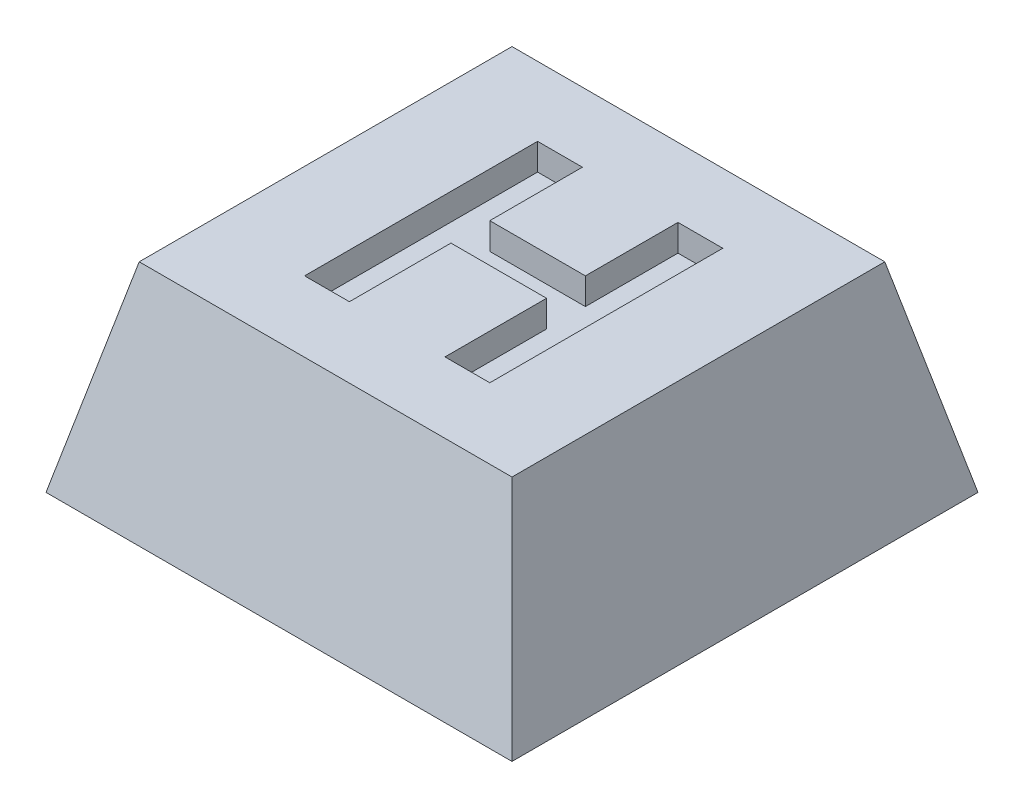
ISO-10303-21;
HEADER;
FILE_DESCRIPTION(('STEP AP214'),'2;1');
FILE_NAME('part.step','',(''),(''),'','','');
FILE_SCHEMA(('AUTOMOTIVE_DESIGN { 1 0 10303 214 1 1 1 1 }'));
ENDSEC;
DATA;
#1=APPLICATION_CONTEXT('core data for automotive mechanical design processes');
#2=APPLICATION_PROTOCOL_DEFINITION('international standard','automotive_design',2000,#1);
#3=PRODUCT_CONTEXT('',#1,'mechanical');
#4=PRODUCT('Part','Part','',(#3));
#5=PRODUCT_RELATED_PRODUCT_CATEGORY('part','',(#4));
#6=PRODUCT_DEFINITION_FORMATION('','',#4);
#7=PRODUCT_DEFINITION_CONTEXT('part definition',#1,'design');
#8=PRODUCT_DEFINITION('design','',#6,#7);
#9=PRODUCT_DEFINITION_SHAPE('','',#8);
#10=(LENGTH_UNIT() NAMED_UNIT(*) SI_UNIT(.MILLI.,.METRE.));
#11=(NAMED_UNIT(*) PLANE_ANGLE_UNIT() SI_UNIT($,.RADIAN.));
#12=(NAMED_UNIT(*) SI_UNIT($,.STERADIAN.) SOLID_ANGLE_UNIT());
#13=UNCERTAINTY_MEASURE_WITH_UNIT(LENGTH_MEASURE(1.E-05),#10,'distance_accuracy_value','');
#14=(GEOMETRIC_REPRESENTATION_CONTEXT(3) GLOBAL_UNCERTAINTY_ASSIGNED_CONTEXT((#13)) GLOBAL_UNIT_ASSIGNED_CONTEXT((#10,
#11,#12)) REPRESENTATION_CONTEXT('',''));
#15=CARTESIAN_POINT('',(0.,0.,0.));
#16=DIRECTION('',(0.,0.,1.));
#17=DIRECTION('',(1.,0.,0.));
#18=AXIS2_PLACEMENT_3D('',#15,#16,#17);
#19=CARTESIAN_POINT('',(0.,3.,0.));
#20=DIRECTION('',(0.,-1.,0.));
#21=DIRECTION('',(0.,0.,-1.));
#22=AXIS2_PLACEMENT_3D('',#19,#20,#21);
#23=PLANE('',#22);
#24=DIRECTION('',(-1.,0.,0.));
#25=VECTOR('',#24,1.);
#26=CARTESIAN_POINT('',(11.,3.,-0.7));
#27=LINE('',#26,#25);
#28=CARTESIAN_POINT('',(6.3,3.,-0.7));
#29=VERTEX_POINT('',#28);
#30=CARTESIAN_POINT('',(0.7,3.,-0.7));
#31=VERTEX_POINT('',#30);
#32=EDGE_CURVE('E65',#29,#31,#27,.T.);
#33=ORIENTED_EDGE('',*,*,#32,.F.);
#34=DIRECTION('',(0.,0.,1.));
#35=VECTOR('',#34,1.);
#36=CARTESIAN_POINT('',(6.3,3.,-7.));
#37=LINE('',#36,#35);
#38=CARTESIAN_POINT('',(6.3,3.,-6.3));
#39=VERTEX_POINT('',#38);
#40=EDGE_CURVE('E206',#39,#29,#37,.T.);
#41=ORIENTED_EDGE('',*,*,#40,.F.);
#42=DIRECTION('',(-1.,0.,0.));
#43=VECTOR('',#42,1.);
#44=CARTESIAN_POINT('',(11.,3.,-6.3));
#45=LINE('',#44,#43);
#46=CARTESIAN_POINT('',(0.699999999999998,3.,-6.3));
#47=VERTEX_POINT('',#46);
#48=EDGE_CURVE('E193',#39,#47,#45,.T.);
#49=ORIENTED_EDGE('',*,*,#48,.T.);
#50=DIRECTION('',(0.,0.,1.));
#51=VECTOR('',#50,1.);
#52=CARTESIAN_POINT('',(0.7,3.,-7.));
#53=LINE('',#52,#51);
#54=EDGE_CURVE('E207',#47,#31,#53,.T.);
#55=ORIENTED_EDGE('',*,*,#54,.T.);
#56=EDGE_LOOP('',(#33,#41,#49,#55));
#57=FACE_BOUND('',#56,.T.);
#58=DIRECTION('',(-1.,0.,0.));
#59=VECTOR('',#58,1.);
#60=CARTESIAN_POINT('',(2.79808060124008,3.,-1.75928235155919));
#61=LINE('',#60,#59);
#62=CARTESIAN_POINT('',(2.79808060124008,3.,-1.75928235155919));
#63=VERTEX_POINT('',#62);
#64=CARTESIAN_POINT('',(2.12500367816316,3.,-1.75928235155919));
#65=VERTEX_POINT('',#64);
#66=EDGE_CURVE('E58',#63,#65,#61,.T.);
#67=ORIENTED_EDGE('',*,*,#66,.T.);
#68=DIRECTION('',(0.,0.,-1.));
#69=VECTOR('',#68,1.);
#70=CARTESIAN_POINT('',(2.12500367816316,3.,-1.75928235155919));
#71=LINE('',#70,#69);
#72=CARTESIAN_POINT('',(2.12500367816316,3.,-5.25928235155919));
#73=VERTEX_POINT('',#72);
#74=EDGE_CURVE('E177',#65,#73,#71,.T.);
#75=ORIENTED_EDGE('',*,*,#74,.T.);
#76=DIRECTION('',(1.,0.,0.));
#77=VECTOR('',#76,1.);
#78=CARTESIAN_POINT('',(2.12500367816316,3.,-5.25928235155919));
#79=LINE('',#78,#77);
#80=CARTESIAN_POINT('',(2.79808060124008,3.,-5.25928235155919));
#81=VERTEX_POINT('',#80);
#82=EDGE_CURVE('E532',#73,#81,#79,.T.);
#83=ORIENTED_EDGE('',*,*,#82,.T.);
#84=DIRECTION('',(0.,0.,1.));
#85=VECTOR('',#84,1.);
#86=CARTESIAN_POINT('',(2.79808060124008,3.,-5.25928235155919));
#87=LINE('',#86,#85);
#88=CARTESIAN_POINT('',(2.79808060124008,3.,-3.86825671053355));
#89=VERTEX_POINT('',#88);
#90=EDGE_CURVE('E534',#81,#89,#87,.T.);
#91=ORIENTED_EDGE('',*,*,#90,.T.);
#92=DIRECTION('',(1.,0.,0.));
#93=VECTOR('',#92,1.);
#94=CARTESIAN_POINT('',(2.79808060124008,3.,-3.86825671053355));
#95=LINE('',#94,#93);
#96=CARTESIAN_POINT('',(4.23397803713752,3.,-3.86825671053355));
#97=VERTEX_POINT('',#96);
#98=EDGE_CURVE('E539',#89,#97,#95,.T.);
#99=ORIENTED_EDGE('',*,*,#98,.T.);
#100=DIRECTION('',(0.,0.,-1.));
#101=VECTOR('',#100,1.);
#102=CARTESIAN_POINT('',(4.23397803713752,3.,-3.86825671053355));
#103=LINE('',#102,#101);
#104=CARTESIAN_POINT('',(4.23397803713752,3.,-5.25928235155919));
#105=VERTEX_POINT('',#104);
#106=EDGE_CURVE('E549',#97,#105,#103,.T.);
#107=ORIENTED_EDGE('',*,*,#106,.T.);
#108=DIRECTION('',(1.,0.,0.));
#109=VECTOR('',#108,1.);
#110=CARTESIAN_POINT('',(4.23397803713752,3.,-5.25928235155919));
#111=LINE('',#110,#109);
#112=CARTESIAN_POINT('',(4.90705496021444,3.,-5.25928235155919));
#113=VERTEX_POINT('',#112);
#114=EDGE_CURVE('E553',#105,#113,#111,.T.);
#115=ORIENTED_EDGE('',*,*,#114,.T.);
#116=DIRECTION('',(0.,0.,1.));
#117=VECTOR('',#116,1.);
#118=CARTESIAN_POINT('',(4.90705496021444,3.,-5.25928235155919));
#119=LINE('',#118,#117);
#120=CARTESIAN_POINT('',(4.90705496021444,3.,-1.75928235155919));
#121=VERTEX_POINT('',#120);
#122=EDGE_CURVE('E557',#113,#121,#119,.T.);
#123=ORIENTED_EDGE('',*,*,#122,.T.);
#124=DIRECTION('',(-1.,0.,0.));
#125=VECTOR('',#124,1.);
#126=CARTESIAN_POINT('',(4.90705496021444,3.,-1.75928235155919));
#127=LINE('',#126,#125);
#128=CARTESIAN_POINT('',(4.23397803713752,3.,-1.75928235155919));
#129=VERTEX_POINT('',#128);
#130=EDGE_CURVE('E498',#121,#129,#127,.T.);
#131=ORIENTED_EDGE('',*,*,#130,.T.);
#132=DIRECTION('',(0.,0.,-1.));
#133=VECTOR('',#132,1.);
#134=CARTESIAN_POINT('',(4.23397803713752,3.,-1.75928235155919));
#135=LINE('',#134,#133);
#136=CARTESIAN_POINT('',(4.23397803713752,3.,-3.28492337720022));
#137=VERTEX_POINT('',#136);
#138=EDGE_CURVE('E493',#129,#137,#135,.T.);
#139=ORIENTED_EDGE('',*,*,#138,.T.);
#140=DIRECTION('',(-1.,0.,0.));
#141=VECTOR('',#140,1.);
#142=CARTESIAN_POINT('',(4.23397803713752,3.,-3.28492337720022));
#143=LINE('',#142,#141);
#144=CARTESIAN_POINT('',(2.79808060124008,3.,-3.28492337720022));
#145=VERTEX_POINT('',#144);
#146=EDGE_CURVE('E487',#137,#145,#143,.T.);
#147=ORIENTED_EDGE('',*,*,#146,.T.);
#148=DIRECTION('',(0.,0.,1.));
#149=VECTOR('',#148,1.);
#150=CARTESIAN_POINT('',(2.79808060124008,3.,-3.28492337720022));
#151=LINE('',#150,#149);
#152=EDGE_CURVE('E173',#145,#63,#151,.T.);
#153=ORIENTED_EDGE('',*,*,#152,.T.);
#154=EDGE_LOOP('',(#67,#75,#83,#91,#99,#107,#115,#123,#131,#139,#147,#153));
#155=FACE_BOUND('',#154,.T.);
#156=ADVANCED_FACE('F42',(#57,#155),#23,.F.);
#157=CARTESIAN_POINT('',(7.,0.,-7.));
#158=DIRECTION('',(-0.973841209741793,-0.227229615606418,0.));
#159=DIRECTION('',(0.227229615606418,-0.973841209741793,0.));
#160=AXIS2_PLACEMENT_3D('',#157,#158,#159);
#161=PLANE('',#160);
#162=DIRECTION('',(-0.221581128241521,0.949633406749377,-0.221581128241521));
#163=VECTOR('',#162,1.);
#164=CARTESIAN_POINT('',(6.6563126252505,1.47294589178357,-0.343687374749499));
#165=LINE('',#164,#163);
#166=CARTESIAN_POINT('',(7.,0.,0.));
#167=VERTEX_POINT('',#166);
#168=EDGE_CURVE('E203',#167,#29,#165,.T.);
#169=ORIENTED_EDGE('',*,*,#168,.F.);
#170=DIRECTION('',(0.,0.,-1.));
#171=VECTOR('',#170,1.);
#172=CARTESIAN_POINT('',(7.,0.,0.));
#173=LINE('',#172,#171);
#174=CARTESIAN_POINT('',(7.,0.,-7.));
#175=VERTEX_POINT('',#174);
#176=EDGE_CURVE('E221',#167,#175,#173,.T.);
#177=ORIENTED_EDGE('',*,*,#176,.T.);
#178=DIRECTION('',(0.221581128241521,-0.949633406749377,-0.221581128241521));
#179=VECTOR('',#178,1.);
#180=CARTESIAN_POINT('',(7.,0.,-7.));
#181=LINE('',#180,#179);
#182=EDGE_CURVE('E197',#39,#175,#181,.T.);
#183=ORIENTED_EDGE('',*,*,#182,.F.);
#184=ORIENTED_EDGE('',*,*,#40,.T.);
#185=EDGE_LOOP('',(#169,#177,#183,#184));
#186=FACE_BOUND('',#185,.T.);
#187=ADVANCED_FACE('F246',(#186),#161,.F.);
#188=CARTESIAN_POINT('',(0.,0.,-7.));
#189=DIRECTION('',(0.973841209741793,-0.227229615606418,0.));
#190=DIRECTION('',(0.227229615606418,0.973841209741793,0.));
#191=AXIS2_PLACEMENT_3D('',#188,#189,#190);
#192=PLANE('',#191);
#193=DIRECTION('',(-0.221581128241521,-0.949633406749378,0.221581128241521));
#194=VECTOR('',#193,1.);
#195=CARTESIAN_POINT('',(0.343687374749499,1.47294589178357,-0.3436873747495));
#196=LINE('',#195,#194);
#197=CARTESIAN_POINT('',(0.,0.,0.));
#198=VERTEX_POINT('',#197);
#199=EDGE_CURVE('E11',#31,#198,#196,.T.);
#200=ORIENTED_EDGE('',*,*,#199,.F.);
#201=ORIENTED_EDGE('',*,*,#54,.F.);
#202=DIRECTION('',(0.221581128241521,0.949633406749377,0.221581128241521));
#203=VECTOR('',#202,1.);
#204=CARTESIAN_POINT('',(0.,0.,-7.));
#205=LINE('',#204,#203);
#206=CARTESIAN_POINT('',(0.,0.,-7.));
#207=VERTEX_POINT('',#206);
#208=EDGE_CURVE('E51',#207,#47,#205,.T.);
#209=ORIENTED_EDGE('',*,*,#208,.F.);
#210=DIRECTION('',(0.,0.,1.));
#211=VECTOR('',#210,1.);
#212=CARTESIAN_POINT('',(0.,0.,0.));
#213=LINE('',#212,#211);
#214=EDGE_CURVE('E211',#207,#198,#213,.T.);
#215=ORIENTED_EDGE('',*,*,#214,.T.);
#216=EDGE_LOOP('',(#200,#201,#209,#215));
#217=FACE_BOUND('',#216,.T.);
#218=ADVANCED_FACE('F239',(#217),#192,.F.);
#219=CARTESIAN_POINT('',(0.,0.,0.));
#220=DIRECTION('',(0.,-1.,0.));
#221=DIRECTION('',(0.,0.,-1.));
#222=AXIS2_PLACEMENT_3D('',#219,#220,#221);
#223=PLANE('',#222);
#224=CARTESIAN_POINT('',(3.5,0.,-3.5));
#225=DIRECTION('',(0.,-1.,0.));
#226=DIRECTION('',(0.,0.,-1.));
#227=AXIS2_PLACEMENT_3D('',#224,#225,#226);
#228=CIRCLE('',#227,1.8);
#229=CARTESIAN_POINT('',(3.5,0.,-5.3));
#230=VERTEX_POINT('',#229);
#231=EDGE_CURVE('E179',#230,#230,#228,.T.);
#232=ORIENTED_EDGE('',*,*,#231,.F.);
#233=EDGE_LOOP('',(#232));
#234=FACE_BOUND('',#233,.T.);
#235=ORIENTED_EDGE('',*,*,#214,.F.);
#236=DIRECTION('',(-1.,0.,0.));
#237=VECTOR('',#236,1.);
#238=CARTESIAN_POINT('',(0.,0.,-7.));
#239=LINE('',#238,#237);
#240=EDGE_CURVE('E225',#175,#207,#239,.T.);
#241=ORIENTED_EDGE('',*,*,#240,.F.);
#242=ORIENTED_EDGE('',*,*,#176,.F.);
#243=DIRECTION('',(1.,0.,0.));
#244=VECTOR('',#243,1.);
#245=CARTESIAN_POINT('',(0.,0.,0.));
#246=LINE('',#245,#244);
#247=EDGE_CURVE('E218',#198,#167,#246,.T.);
#248=ORIENTED_EDGE('',*,*,#247,.F.);
#249=EDGE_LOOP('',(#235,#241,#242,#248));
#250=FACE_BOUND('',#249,.T.);
#251=ADVANCED_FACE('F44',(#234,#250),#223,.T.);
#252=CARTESIAN_POINT('',(11.,3.,-6.3));
#253=DIRECTION('',(0.,0.227229615606418,-0.973841209741793));
#254=DIRECTION('',(0.,0.973841209741793,0.227229615606418));
#255=AXIS2_PLACEMENT_3D('',#252,#253,#254);
#256=PLANE('',#255);
#257=ORIENTED_EDGE('',*,*,#182,.T.);
#258=ORIENTED_EDGE('',*,*,#240,.T.);
#259=ORIENTED_EDGE('',*,*,#208,.T.);
#260=ORIENTED_EDGE('',*,*,#48,.F.);
#261=EDGE_LOOP('',(#257,#258,#259,#260));
#262=FACE_BOUND('',#261,.T.);
#263=ADVANCED_FACE('F230',(#262),#256,.T.);
#264=CARTESIAN_POINT('',(11.,0.,0.));
#265=DIRECTION('',(0.,0.227229615606418,0.973841209741793));
#266=DIRECTION('',(0.,-0.973841209741793,0.227229615606418));
#267=AXIS2_PLACEMENT_3D('',#264,#265,#266);
#268=PLANE('',#267);
#269=ORIENTED_EDGE('',*,*,#168,.T.);
#270=ORIENTED_EDGE('',*,*,#32,.T.);
#271=ORIENTED_EDGE('',*,*,#199,.T.);
#272=ORIENTED_EDGE('',*,*,#247,.T.);
#273=EDGE_LOOP('',(#269,#270,#271,#272));
#274=FACE_BOUND('',#273,.T.);
#275=ADVANCED_FACE('F241',(#274),#268,.T.);
#276=CARTESIAN_POINT('',(3.5,0.8,-3.5));
#277=DIRECTION('',(0.,-1.,0.));
#278=DIRECTION('',(0.,0.,-1.));
#279=AXIS2_PLACEMENT_3D('',#276,#277,#278);
#280=CYLINDRICAL_SURFACE('',#279,1.8);
#281=CARTESIAN_POINT('',(3.5,0.8,-3.5));
#282=DIRECTION('',(0.,-1.,0.));
#283=DIRECTION('',(0.,0.,-1.));
#284=AXIS2_PLACEMENT_3D('',#281,#282,#283);
#285=CIRCLE('',#284,1.8);
#286=CARTESIAN_POINT('',(3.5,0.8,-5.3));
#287=VERTEX_POINT('',#286);
#288=EDGE_CURVE('E185',#287,#287,#285,.T.);
#289=ORIENTED_EDGE('',*,*,#288,.F.);
#290=EDGE_LOOP('',(#289));
#291=FACE_BOUND('',#290,.T.);
#292=ORIENTED_EDGE('',*,*,#231,.T.);
#293=EDGE_LOOP('',(#292));
#294=FACE_BOUND('',#293,.T.);
#295=ADVANCED_FACE('F266',(#291,#294),#280,.F.);
#296=CARTESIAN_POINT('',(3.5,0.8,-3.5));
#297=DIRECTION('',(0.,-1.,0.));
#298=DIRECTION('',(0.,0.,-1.));
#299=AXIS2_PLACEMENT_3D('',#296,#297,#298);
#300=PLANE('',#299);
#301=ORIENTED_EDGE('',*,*,#288,.T.);
#302=EDGE_LOOP('',(#301));
#303=FACE_BOUND('',#302,.T.);
#304=ADVANCED_FACE('F269',(#303),#300,.T.);
#305=CARTESIAN_POINT('',(2.79808060124008,2.6,-1.75928235155919));
#306=DIRECTION('',(0.,0.,-1.));
#307=DIRECTION('',(-1.,0.,0.));
#308=AXIS2_PLACEMENT_3D('',#305,#306,#307);
#309=PLANE('',#308);
#310=ORIENTED_EDGE('',*,*,#66,.F.);
#311=DIRECTION('',(0.,1.,0.));
#312=VECTOR('',#311,1.);
#313=CARTESIAN_POINT('',(2.79808060124008,2.6,-1.75928235155919));
#314=LINE('',#313,#312);
#315=CARTESIAN_POINT('',(2.79808060124008,2.6,-1.75928235155919));
#316=VERTEX_POINT('',#315);
#317=EDGE_CURVE('E171',#316,#63,#314,.T.);
#318=ORIENTED_EDGE('',*,*,#317,.F.);
#319=DIRECTION('',(-1.,0.,0.));
#320=VECTOR('',#319,1.);
#321=CARTESIAN_POINT('',(2.79808060124008,2.6,-1.75928235155919));
#322=LINE('',#321,#320);
#323=CARTESIAN_POINT('',(2.12500367816316,2.6,-1.75928235155919));
#324=VERTEX_POINT('',#323);
#325=EDGE_CURVE('E161',#316,#324,#322,.T.);
#326=ORIENTED_EDGE('',*,*,#325,.T.);
#327=DIRECTION('',(0.,1.,0.));
#328=VECTOR('',#327,1.);
#329=CARTESIAN_POINT('',(2.12500367816316,2.6,-1.75928235155919));
#330=LINE('',#329,#328);
#331=EDGE_CURVE('E170',#324,#65,#330,.T.);
#332=ORIENTED_EDGE('',*,*,#331,.T.);
#333=EDGE_LOOP('',(#310,#318,#326,#332));
#334=FACE_BOUND('',#333,.T.);
#335=ADVANCED_FACE('F169',(#334),#309,.T.);
#336=CARTESIAN_POINT('',(2.12500367816316,2.6,-1.75928235155919));
#337=DIRECTION('',(1.,0.,0.));
#338=DIRECTION('',(0.,0.,-1.));
#339=AXIS2_PLACEMENT_3D('',#336,#337,#338);
#340=PLANE('',#339);
#341=ORIENTED_EDGE('',*,*,#74,.F.);
#342=ORIENTED_EDGE('',*,*,#331,.F.);
#343=DIRECTION('',(0.,0.,-1.));
#344=VECTOR('',#343,1.);
#345=CARTESIAN_POINT('',(2.12500367816316,2.6,-1.75928235155919));
#346=LINE('',#345,#344);
#347=CARTESIAN_POINT('',(2.12500367816316,2.6,-5.25928235155919));
#348=VERTEX_POINT('',#347);
#349=EDGE_CURVE('E157',#324,#348,#346,.T.);
#350=ORIENTED_EDGE('',*,*,#349,.T.);
#351=DIRECTION('',(0.,1.,0.));
#352=VECTOR('',#351,1.);
#353=CARTESIAN_POINT('',(2.12500367816316,2.6,-5.25928235155919));
#354=LINE('',#353,#352);
#355=EDGE_CURVE('E180',#348,#73,#354,.T.);
#356=ORIENTED_EDGE('',*,*,#355,.T.);
#357=EDGE_LOOP('',(#341,#342,#350,#356));
#358=FACE_BOUND('',#357,.T.);
#359=ADVANCED_FACE('F175',(#358),#340,.T.);
#360=CARTESIAN_POINT('',(2.12500367816316,2.6,-5.25928235155919));
#361=DIRECTION('',(0.,0.,1.));
#362=DIRECTION('',(1.,0.,0.));
#363=AXIS2_PLACEMENT_3D('',#360,#361,#362);
#364=PLANE('',#363);
#365=ORIENTED_EDGE('',*,*,#82,.F.);
#366=ORIENTED_EDGE('',*,*,#355,.F.);
#367=DIRECTION('',(1.,0.,0.));
#368=VECTOR('',#367,1.);
#369=CARTESIAN_POINT('',(2.12500367816316,2.6,-5.25928235155919));
#370=LINE('',#369,#368);
#371=CARTESIAN_POINT('',(2.79808060124008,2.6,-5.25928235155919));
#372=VERTEX_POINT('',#371);
#373=EDGE_CURVE('E163',#348,#372,#370,.T.);
#374=ORIENTED_EDGE('',*,*,#373,.T.);
#375=DIRECTION('',(0.,1.,0.));
#376=VECTOR('',#375,1.);
#377=CARTESIAN_POINT('',(2.79808060124008,2.6,-5.25928235155919));
#378=LINE('',#377,#376);
#379=EDGE_CURVE('E187',#372,#81,#378,.T.);
#380=ORIENTED_EDGE('',*,*,#379,.T.);
#381=EDGE_LOOP('',(#365,#366,#374,#380));
#382=FACE_BOUND('',#381,.T.);
#383=ADVANCED_FACE('F278',(#382),#364,.T.);
#384=CARTESIAN_POINT('',(2.79808060124008,2.6,-5.25928235155919));
#385=DIRECTION('',(-1.,0.,0.));
#386=DIRECTION('',(0.,0.,1.));
#387=AXIS2_PLACEMENT_3D('',#384,#385,#386);
#388=PLANE('',#387);
#389=ORIENTED_EDGE('',*,*,#90,.F.);
#390=ORIENTED_EDGE('',*,*,#379,.F.);
#391=DIRECTION('',(0.,0.,1.));
#392=VECTOR('',#391,1.);
#393=CARTESIAN_POINT('',(2.79808060124008,2.6,-5.25928235155919));
#394=LINE('',#393,#392);
#395=CARTESIAN_POINT('',(2.79808060124008,2.6,-3.86825671053355));
#396=VERTEX_POINT('',#395);
#397=EDGE_CURVE('E593',#372,#396,#394,.T.);
#398=ORIENTED_EDGE('',*,*,#397,.T.);
#399=DIRECTION('',(0.,1.,0.));
#400=VECTOR('',#399,1.);
#401=CARTESIAN_POINT('',(2.79808060124008,2.6,-3.86825671053355));
#402=LINE('',#401,#400);
#403=EDGE_CURVE('E525',#396,#89,#402,.T.);
#404=ORIENTED_EDGE('',*,*,#403,.T.);
#405=EDGE_LOOP('',(#389,#390,#398,#404));
#406=FACE_BOUND('',#405,.T.);
#407=ADVANCED_FACE('F281',(#406),#388,.T.);
#408=CARTESIAN_POINT('',(2.79808060124008,2.6,-3.86825671053355));
#409=DIRECTION('',(0.,0.,1.));
#410=DIRECTION('',(1.,0.,0.));
#411=AXIS2_PLACEMENT_3D('',#408,#409,#410);
#412=PLANE('',#411);
#413=ORIENTED_EDGE('',*,*,#98,.F.);
#414=ORIENTED_EDGE('',*,*,#403,.F.);
#415=DIRECTION('',(1.,0.,0.));
#416=VECTOR('',#415,1.);
#417=CARTESIAN_POINT('',(2.79808060124008,2.6,-3.86825671053355));
#418=LINE('',#417,#416);
#419=CARTESIAN_POINT('',(4.23397803713752,2.6,-3.86825671053355));
#420=VERTEX_POINT('',#419);
#421=EDGE_CURVE('E590',#396,#420,#418,.T.);
#422=ORIENTED_EDGE('',*,*,#421,.T.);
#423=DIRECTION('',(0.,1.,0.));
#424=VECTOR('',#423,1.);
#425=CARTESIAN_POINT('',(4.23397803713752,2.6,-3.86825671053355));
#426=LINE('',#425,#424);
#427=EDGE_CURVE('E522',#420,#97,#426,.T.);
#428=ORIENTED_EDGE('',*,*,#427,.T.);
#429=EDGE_LOOP('',(#413,#414,#422,#428));
#430=FACE_BOUND('',#429,.T.);
#431=ADVANCED_FACE('F285',(#430),#412,.T.);
#432=CARTESIAN_POINT('',(4.23397803713752,2.6,-3.86825671053355));
#433=DIRECTION('',(1.,0.,0.));
#434=DIRECTION('',(0.,0.,-1.));
#435=AXIS2_PLACEMENT_3D('',#432,#433,#434);
#436=PLANE('',#435);
#437=ORIENTED_EDGE('',*,*,#106,.F.);
#438=ORIENTED_EDGE('',*,*,#427,.F.);
#439=DIRECTION('',(0.,0.,-1.));
#440=VECTOR('',#439,1.);
#441=CARTESIAN_POINT('',(4.23397803713752,2.6,-3.86825671053355));
#442=LINE('',#441,#440);
#443=CARTESIAN_POINT('',(4.23397803713752,2.6,-5.25928235155919));
#444=VERTEX_POINT('',#443);
#445=EDGE_CURVE('E587',#420,#444,#442,.T.);
#446=ORIENTED_EDGE('',*,*,#445,.T.);
#447=DIRECTION('',(0.,1.,0.));
#448=VECTOR('',#447,1.);
#449=CARTESIAN_POINT('',(4.23397803713752,2.6,-5.25928235155919));
#450=LINE('',#449,#448);
#451=EDGE_CURVE('E519',#444,#105,#450,.T.);
#452=ORIENTED_EDGE('',*,*,#451,.T.);
#453=EDGE_LOOP('',(#437,#438,#446,#452));
#454=FACE_BOUND('',#453,.T.);
#455=ADVANCED_FACE('F289',(#454),#436,.T.);
#456=CARTESIAN_POINT('',(4.23397803713752,2.6,-5.25928235155919));
#457=DIRECTION('',(0.,0.,1.));
#458=DIRECTION('',(1.,0.,0.));
#459=AXIS2_PLACEMENT_3D('',#456,#457,#458);
#460=PLANE('',#459);
#461=ORIENTED_EDGE('',*,*,#114,.F.);
#462=ORIENTED_EDGE('',*,*,#451,.F.);
#463=DIRECTION('',(1.,0.,0.));
#464=VECTOR('',#463,1.);
#465=CARTESIAN_POINT('',(4.23397803713752,2.6,-5.25928235155919));
#466=LINE('',#465,#464);
#467=CARTESIAN_POINT('',(4.90705496021444,2.6,-5.25928235155919));
#468=VERTEX_POINT('',#467);
#469=EDGE_CURVE('E584',#444,#468,#466,.T.);
#470=ORIENTED_EDGE('',*,*,#469,.T.);
#471=DIRECTION('',(0.,1.,0.));
#472=VECTOR('',#471,1.);
#473=CARTESIAN_POINT('',(4.90705496021444,2.6,-5.25928235155919));
#474=LINE('',#473,#472);
#475=EDGE_CURVE('E516',#468,#113,#474,.T.);
#476=ORIENTED_EDGE('',*,*,#475,.T.);
#477=EDGE_LOOP('',(#461,#462,#470,#476));
#478=FACE_BOUND('',#477,.T.);
#479=ADVANCED_FACE('F293',(#478),#460,.T.);
#480=CARTESIAN_POINT('',(4.90705496021444,2.6,-5.25928235155919));
#481=DIRECTION('',(-1.,0.,0.));
#482=DIRECTION('',(0.,0.,1.));
#483=AXIS2_PLACEMENT_3D('',#480,#481,#482);
#484=PLANE('',#483);
#485=ORIENTED_EDGE('',*,*,#122,.F.);
#486=ORIENTED_EDGE('',*,*,#475,.F.);
#487=DIRECTION('',(0.,0.,1.));
#488=VECTOR('',#487,1.);
#489=CARTESIAN_POINT('',(4.90705496021444,2.6,-5.25928235155919));
#490=LINE('',#489,#488);
#491=CARTESIAN_POINT('',(4.90705496021444,2.6,-1.75928235155919));
#492=VERTEX_POINT('',#491);
#493=EDGE_CURVE('E581',#468,#492,#490,.T.);
#494=ORIENTED_EDGE('',*,*,#493,.T.);
#495=DIRECTION('',(0.,1.,0.));
#496=VECTOR('',#495,1.);
#497=CARTESIAN_POINT('',(4.90705496021444,2.6,-1.75928235155919));
#498=LINE('',#497,#496);
#499=EDGE_CURVE('E513',#492,#121,#498,.T.);
#500=ORIENTED_EDGE('',*,*,#499,.T.);
#501=EDGE_LOOP('',(#485,#486,#494,#500));
#502=FACE_BOUND('',#501,.T.);
#503=ADVANCED_FACE('F297',(#502),#484,.T.);
#504=CARTESIAN_POINT('',(4.90705496021444,2.6,-1.75928235155919));
#505=DIRECTION('',(0.,0.,-1.));
#506=DIRECTION('',(-1.,0.,0.));
#507=AXIS2_PLACEMENT_3D('',#504,#505,#506);
#508=PLANE('',#507);
#509=ORIENTED_EDGE('',*,*,#130,.F.);
#510=ORIENTED_EDGE('',*,*,#499,.F.);
#511=DIRECTION('',(-1.,0.,0.));
#512=VECTOR('',#511,1.);
#513=CARTESIAN_POINT('',(4.90705496021444,2.6,-1.75928235155919));
#514=LINE('',#513,#512);
#515=CARTESIAN_POINT('',(4.23397803713752,2.6,-1.75928235155919));
#516=VERTEX_POINT('',#515);
#517=EDGE_CURVE('E566',#492,#516,#514,.T.);
#518=ORIENTED_EDGE('',*,*,#517,.T.);
#519=DIRECTION('',(0.,1.,0.));
#520=VECTOR('',#519,1.);
#521=CARTESIAN_POINT('',(4.23397803713752,2.6,-1.75928235155919));
#522=LINE('',#521,#520);
#523=EDGE_CURVE('E510',#516,#129,#522,.T.);
#524=ORIENTED_EDGE('',*,*,#523,.T.);
#525=EDGE_LOOP('',(#509,#510,#518,#524));
#526=FACE_BOUND('',#525,.T.);
#527=ADVANCED_FACE('F301',(#526),#508,.T.);
#528=CARTESIAN_POINT('',(4.23397803713752,2.6,-1.75928235155919));
#529=DIRECTION('',(1.,0.,0.));
#530=DIRECTION('',(0.,0.,-1.));
#531=AXIS2_PLACEMENT_3D('',#528,#529,#530);
#532=PLANE('',#531);
#533=ORIENTED_EDGE('',*,*,#138,.F.);
#534=ORIENTED_EDGE('',*,*,#523,.F.);
#535=DIRECTION('',(0.,0.,-1.));
#536=VECTOR('',#535,1.);
#537=CARTESIAN_POINT('',(4.23397803713752,2.6,-1.75928235155919));
#538=LINE('',#537,#536);
#539=CARTESIAN_POINT('',(4.23397803713752,2.6,-3.28492337720022));
#540=VERTEX_POINT('',#539);
#541=EDGE_CURVE('E568',#516,#540,#538,.T.);
#542=ORIENTED_EDGE('',*,*,#541,.T.);
#543=DIRECTION('',(0.,1.,0.));
#544=VECTOR('',#543,1.);
#545=CARTESIAN_POINT('',(4.23397803713752,2.6,-3.28492337720022));
#546=LINE('',#545,#544);
#547=EDGE_CURVE('E507',#540,#137,#546,.T.);
#548=ORIENTED_EDGE('',*,*,#547,.T.);
#549=EDGE_LOOP('',(#533,#534,#542,#548));
#550=FACE_BOUND('',#549,.T.);
#551=ADVANCED_FACE('F305',(#550),#532,.T.);
#552=CARTESIAN_POINT('',(4.23397803713752,2.6,-3.28492337720022));
#553=DIRECTION('',(0.,0.,-1.));
#554=DIRECTION('',(-1.,0.,0.));
#555=AXIS2_PLACEMENT_3D('',#552,#553,#554);
#556=PLANE('',#555);
#557=ORIENTED_EDGE('',*,*,#146,.F.);
#558=ORIENTED_EDGE('',*,*,#547,.F.);
#559=DIRECTION('',(-1.,0.,0.));
#560=VECTOR('',#559,1.);
#561=CARTESIAN_POINT('',(4.23397803713752,2.6,-3.28492337720022));
#562=LINE('',#561,#560);
#563=CARTESIAN_POINT('',(2.79808060124008,2.6,-3.28492337720022));
#564=VERTEX_POINT('',#563);
#565=EDGE_CURVE('E570',#540,#564,#562,.T.);
#566=ORIENTED_EDGE('',*,*,#565,.T.);
#567=DIRECTION('',(0.,1.,0.));
#568=VECTOR('',#567,1.);
#569=CARTESIAN_POINT('',(2.79808060124008,2.6,-3.28492337720022));
#570=LINE('',#569,#568);
#571=EDGE_CURVE('E485',#564,#145,#570,.T.);
#572=ORIENTED_EDGE('',*,*,#571,.T.);
#573=EDGE_LOOP('',(#557,#558,#566,#572));
#574=FACE_BOUND('',#573,.T.);
#575=ADVANCED_FACE('F309',(#574),#556,.T.);
#576=CARTESIAN_POINT('',(2.79808060124008,2.6,-3.28492337720022));
#577=DIRECTION('',(-1.,0.,0.));
#578=DIRECTION('',(0.,0.,1.));
#579=AXIS2_PLACEMENT_3D('',#576,#577,#578);
#580=PLANE('',#579);
#581=ORIENTED_EDGE('',*,*,#152,.F.);
#582=ORIENTED_EDGE('',*,*,#571,.F.);
#583=DIRECTION('',(0.,0.,1.));
#584=VECTOR('',#583,1.);
#585=CARTESIAN_POINT('',(2.79808060124008,2.6,-3.28492337720022));
#586=LINE('',#585,#584);
#587=EDGE_CURVE('E504',#564,#316,#586,.T.);
#588=ORIENTED_EDGE('',*,*,#587,.T.);
#589=ORIENTED_EDGE('',*,*,#317,.T.);
#590=EDGE_LOOP('',(#581,#582,#588,#589));
#591=FACE_BOUND('',#590,.T.);
#592=ADVANCED_FACE('F313',(#591),#580,.T.);
#593=CARTESIAN_POINT('',(0.,2.6,0.));
#594=DIRECTION('',(0.,-1.,0.));
#595=DIRECTION('',(0.,0.,-1.));
#596=AXIS2_PLACEMENT_3D('',#593,#594,#595);
#597=PLANE('',#596);
#598=ORIENTED_EDGE('',*,*,#325,.F.);
#599=ORIENTED_EDGE('',*,*,#587,.F.);
#600=ORIENTED_EDGE('',*,*,#565,.F.);
#601=ORIENTED_EDGE('',*,*,#541,.F.);
#602=ORIENTED_EDGE('',*,*,#517,.F.);
#603=ORIENTED_EDGE('',*,*,#493,.F.);
#604=ORIENTED_EDGE('',*,*,#469,.F.);
#605=ORIENTED_EDGE('',*,*,#445,.F.);
#606=ORIENTED_EDGE('',*,*,#421,.F.);
#607=ORIENTED_EDGE('',*,*,#397,.F.);
#608=ORIENTED_EDGE('',*,*,#373,.F.);
#609=ORIENTED_EDGE('',*,*,#349,.F.);
#610=EDGE_LOOP('',(#598,#599,#600,#601,#602,#603,#604,#605,#606,#607,#608,#609));
#611=FACE_BOUND('',#610,.T.);
#612=ADVANCED_FACE('F159',(#611),#597,.F.);
#613=CLOSED_SHELL('',(#156,#187,#218,#251,#263,#275,#295,#304,#335,#359,#383,#407,#431,#455,
#479,#503,#527,#551,#575,#592,#612));
#614=MANIFOLD_SOLID_BREP('B2',#613);
#615=ADVANCED_BREP_SHAPE_REPRESENTATION('',(#18,#614),#14);
#616=SHAPE_DEFINITION_REPRESENTATION(#9,#615);
ENDSEC;
END-ISO-10303-21;
